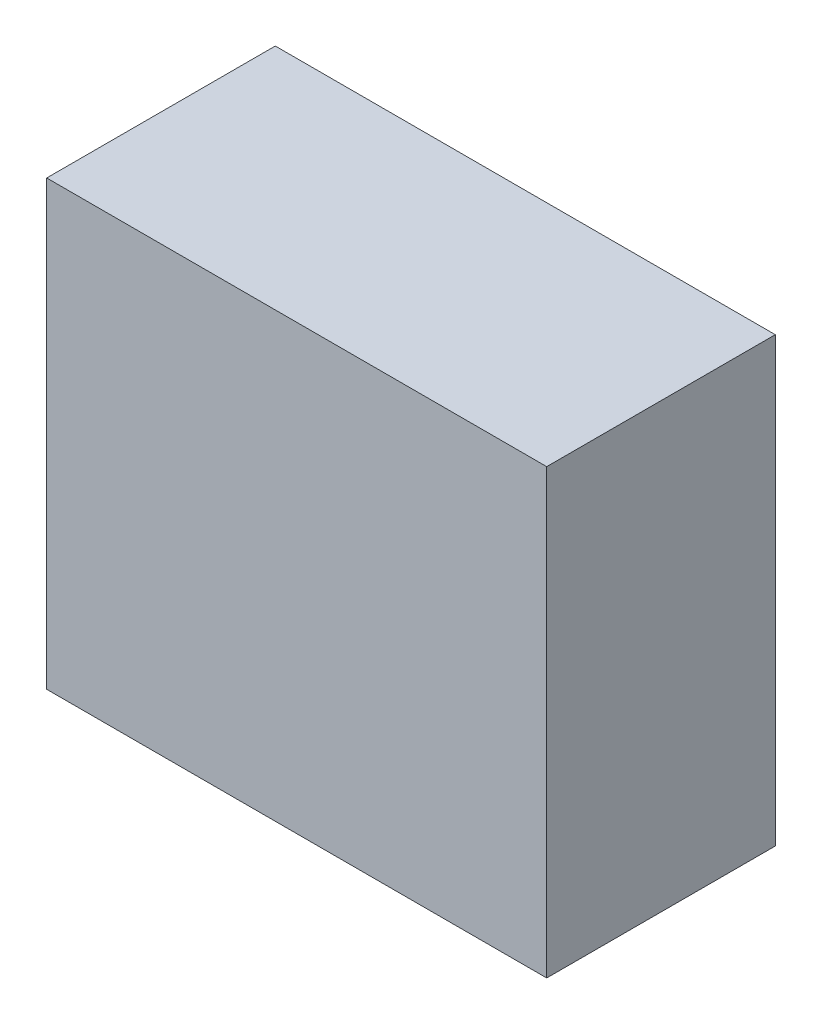
ISO-10303-21;
HEADER;
FILE_DESCRIPTION(('STEP AP214'),'2;1');
FILE_NAME('part.step','',(''),(''),'','','');
FILE_SCHEMA(('AUTOMOTIVE_DESIGN { 1 0 10303 214 1 1 1 1 }'));
ENDSEC;
DATA;
#1=APPLICATION_CONTEXT('core data for automotive mechanical design processes');
#2=APPLICATION_PROTOCOL_DEFINITION('international standard','automotive_design',2000,#1);
#3=PRODUCT_CONTEXT('',#1,'mechanical');
#4=PRODUCT('Part','Part','',(#3));
#5=PRODUCT_RELATED_PRODUCT_CATEGORY('part','',(#4));
#6=PRODUCT_DEFINITION_FORMATION('','',#4);
#7=PRODUCT_DEFINITION_CONTEXT('part definition',#1,'design');
#8=PRODUCT_DEFINITION('design','',#6,#7);
#9=PRODUCT_DEFINITION_SHAPE('','',#8);
#10=(LENGTH_UNIT() NAMED_UNIT(*) SI_UNIT(.MILLI.,.METRE.));
#11=(NAMED_UNIT(*) PLANE_ANGLE_UNIT() SI_UNIT($,.RADIAN.));
#12=(NAMED_UNIT(*) SI_UNIT($,.STERADIAN.) SOLID_ANGLE_UNIT());
#13=UNCERTAINTY_MEASURE_WITH_UNIT(LENGTH_MEASURE(1.E-05),#10,'distance_accuracy_value','');
#14=(GEOMETRIC_REPRESENTATION_CONTEXT(3) GLOBAL_UNCERTAINTY_ASSIGNED_CONTEXT((#13)) GLOBAL_UNIT_ASSIGNED_CONTEXT((#10,
#11,#12)) REPRESENTATION_CONTEXT('',''));
#15=CARTESIAN_POINT('',(0.,0.,0.));
#16=DIRECTION('',(0.,0.,1.));
#17=DIRECTION('',(1.,0.,0.));
#18=AXIS2_PLACEMENT_3D('',#15,#16,#17);
#19=CARTESIAN_POINT('',(-48.2199132321041,21.7800867678959,32.));
#20=DIRECTION('',(1.,0.,0.));
#21=DIRECTION('',(0.,1.,0.));
#22=AXIS2_PLACEMENT_3D('',#19,#20,#21);
#23=PLANE('',#22);
#24=DIRECTION('',(0.,-1.,0.));
#25=VECTOR('',#24,1.);
#26=CARTESIAN_POINT('',(-48.2199132321041,21.7800867678959,0.));
#27=LINE('',#26,#25);
#28=CARTESIAN_POINT('',(-48.2199132321041,21.7800867678959,0.));
#29=VERTEX_POINT('',#28);
#30=CARTESIAN_POINT('',(-48.2199132321041,-40.2199132321041,0.));
#31=VERTEX_POINT('',#30);
#32=EDGE_CURVE('E107',#29,#31,#27,.T.);
#33=ORIENTED_EDGE('',*,*,#32,.T.);
#34=DIRECTION('',(0.,0.,-1.));
#35=VECTOR('',#34,1.);
#36=CARTESIAN_POINT('',(-48.2199132321041,-40.2199132321041,32.));
#37=LINE('',#36,#35);
#38=CARTESIAN_POINT('',(-48.2199132321041,-40.2199132321041,32.));
#39=VERTEX_POINT('',#38);
#40=EDGE_CURVE('E11',#39,#31,#37,.T.);
#41=ORIENTED_EDGE('',*,*,#40,.F.);
#42=DIRECTION('',(0.,-1.,0.));
#43=VECTOR('',#42,1.);
#44=CARTESIAN_POINT('',(-48.2199132321041,21.7800867678959,32.));
#45=LINE('',#44,#43);
#46=CARTESIAN_POINT('',(-48.2199132321041,21.7800867678959,32.));
#47=VERTEX_POINT('',#46);
#48=EDGE_CURVE('E91',#47,#39,#45,.T.);
#49=ORIENTED_EDGE('',*,*,#48,.F.);
#50=DIRECTION('',(0.,0.,-1.));
#51=VECTOR('',#50,1.);
#52=CARTESIAN_POINT('',(-48.2199132321041,21.7800867678959,32.));
#53=LINE('',#52,#51);
#54=EDGE_CURVE('E103',#47,#29,#53,.T.);
#55=ORIENTED_EDGE('',*,*,#54,.T.);
#56=EDGE_LOOP('',(#33,#41,#49,#55));
#57=FACE_BOUND('',#56,.T.);
#58=ADVANCED_FACE('F39',(#57),#23,.F.);
#59=CARTESIAN_POINT('',(-48.2199132321041,-40.2199132321041,32.));
#60=DIRECTION('',(0.,1.,0.));
#61=DIRECTION('',(0.,0.,1.));
#62=AXIS2_PLACEMENT_3D('',#59,#60,#61);
#63=PLANE('',#62);
#64=DIRECTION('',(1.,0.,0.));
#65=VECTOR('',#64,1.);
#66=CARTESIAN_POINT('',(-48.2199132321041,-40.2199132321041,0.));
#67=LINE('',#66,#65);
#68=CARTESIAN_POINT('',(21.7800867678959,-40.2199132321041,0.));
#69=VERTEX_POINT('',#68);
#70=EDGE_CURVE('E96',#31,#69,#67,.T.);
#71=ORIENTED_EDGE('',*,*,#70,.T.);
#72=DIRECTION('',(0.,0.,-1.));
#73=VECTOR('',#72,1.);
#74=CARTESIAN_POINT('',(21.7800867678959,-40.2199132321041,32.));
#75=LINE('',#74,#73);
#76=CARTESIAN_POINT('',(21.7800867678959,-40.2199132321041,32.));
#77=VERTEX_POINT('',#76);
#78=EDGE_CURVE('E48',#77,#69,#75,.T.);
#79=ORIENTED_EDGE('',*,*,#78,.F.);
#80=DIRECTION('',(1.,0.,0.));
#81=VECTOR('',#80,1.);
#82=CARTESIAN_POINT('',(-48.2199132321041,-40.2199132321041,32.));
#83=LINE('',#82,#81);
#84=EDGE_CURVE('E86',#39,#77,#83,.T.);
#85=ORIENTED_EDGE('',*,*,#84,.F.);
#86=ORIENTED_EDGE('',*,*,#40,.T.);
#87=EDGE_LOOP('',(#71,#79,#85,#86));
#88=FACE_BOUND('',#87,.T.);
#89=ADVANCED_FACE('F95',(#88),#63,.F.);
#90=CARTESIAN_POINT('',(21.7800867678959,21.7800867678959,32.));
#91=DIRECTION('',(-1.,0.,0.));
#92=DIRECTION('',(0.,-1.,0.));
#93=AXIS2_PLACEMENT_3D('',#90,#91,#92);
#94=PLANE('',#93);
#95=DIRECTION('',(0.,1.,0.));
#96=VECTOR('',#95,1.);
#97=CARTESIAN_POINT('',(21.7800867678959,21.7800867678959,0.));
#98=LINE('',#97,#96);
#99=CARTESIAN_POINT('',(21.7800867678959,21.7800867678959,0.));
#100=VERTEX_POINT('',#99);
#101=EDGE_CURVE('E73',#69,#100,#98,.T.);
#102=ORIENTED_EDGE('',*,*,#101,.T.);
#103=DIRECTION('',(0.,0.,-1.));
#104=VECTOR('',#103,1.);
#105=CARTESIAN_POINT('',(21.7800867678959,21.7800867678959,32.));
#106=LINE('',#105,#104);
#107=CARTESIAN_POINT('',(21.7800867678959,21.7800867678959,32.));
#108=VERTEX_POINT('',#107);
#109=EDGE_CURVE('E98',#108,#100,#106,.T.);
#110=ORIENTED_EDGE('',*,*,#109,.F.);
#111=DIRECTION('',(0.,1.,0.));
#112=VECTOR('',#111,1.);
#113=CARTESIAN_POINT('',(21.7800867678959,21.7800867678959,32.));
#114=LINE('',#113,#112);
#115=EDGE_CURVE('E89',#77,#108,#114,.T.);
#116=ORIENTED_EDGE('',*,*,#115,.F.);
#117=ORIENTED_EDGE('',*,*,#78,.T.);
#118=EDGE_LOOP('',(#102,#110,#116,#117));
#119=FACE_BOUND('',#118,.T.);
#120=ADVANCED_FACE('F99',(#119),#94,.F.);
#121=CARTESIAN_POINT('',(-48.2199132321041,21.7800867678959,32.));
#122=DIRECTION('',(0.,-1.,0.));
#123=DIRECTION('',(0.,0.,-1.));
#124=AXIS2_PLACEMENT_3D('',#121,#122,#123);
#125=PLANE('',#124);
#126=DIRECTION('',(-1.,0.,0.));
#127=VECTOR('',#126,1.);
#128=CARTESIAN_POINT('',(-48.2199132321041,21.7800867678959,0.));
#129=LINE('',#128,#127);
#130=EDGE_CURVE('E79',#100,#29,#129,.T.);
#131=ORIENTED_EDGE('',*,*,#130,.T.);
#132=ORIENTED_EDGE('',*,*,#54,.F.);
#133=DIRECTION('',(-1.,0.,0.));
#134=VECTOR('',#133,1.);
#135=CARTESIAN_POINT('',(-48.2199132321041,21.7800867678959,32.));
#136=LINE('',#135,#134);
#137=EDGE_CURVE('E56',#108,#47,#136,.T.);
#138=ORIENTED_EDGE('',*,*,#137,.F.);
#139=ORIENTED_EDGE('',*,*,#109,.T.);
#140=EDGE_LOOP('',(#131,#132,#138,#139));
#141=FACE_BOUND('',#140,.T.);
#142=ADVANCED_FACE('F120',(#141),#125,.F.);
#143=CARTESIAN_POINT('',(0.,0.,32.));
#144=DIRECTION('',(0.,0.,1.));
#145=DIRECTION('',(1.,0.,0.));
#146=AXIS2_PLACEMENT_3D('',#143,#144,#145);
#147=PLANE('',#146);
#148=ORIENTED_EDGE('',*,*,#48,.T.);
#149=ORIENTED_EDGE('',*,*,#84,.T.);
#150=ORIENTED_EDGE('',*,*,#115,.T.);
#151=ORIENTED_EDGE('',*,*,#137,.T.);
#152=EDGE_LOOP('',(#148,#149,#150,#151));
#153=FACE_BOUND('',#152,.T.);
#154=ADVANCED_FACE('F87',(#153),#147,.T.);
#155=CARTESIAN_POINT('',(0.,0.,0.));
#156=DIRECTION('',(0.,0.,1.));
#157=DIRECTION('',(1.,0.,0.));
#158=AXIS2_PLACEMENT_3D('',#155,#156,#157);
#159=PLANE('',#158);
#160=ORIENTED_EDGE('',*,*,#32,.F.);
#161=ORIENTED_EDGE('',*,*,#130,.F.);
#162=ORIENTED_EDGE('',*,*,#101,.F.);
#163=ORIENTED_EDGE('',*,*,#70,.F.);
#164=EDGE_LOOP('',(#160,#161,#162,#163));
#165=FACE_BOUND('',#164,.T.);
#166=ADVANCED_FACE('F123',(#165),#159,.F.);
#167=CLOSED_SHELL('',(#58,#89,#120,#142,#154,#166));
#168=MANIFOLD_SOLID_BREP('B2',#167);
#169=ADVANCED_BREP_SHAPE_REPRESENTATION('',(#18,#168),#14);
#170=SHAPE_DEFINITION_REPRESENTATION(#9,#169);
ENDSEC;
END-ISO-10303-21;
